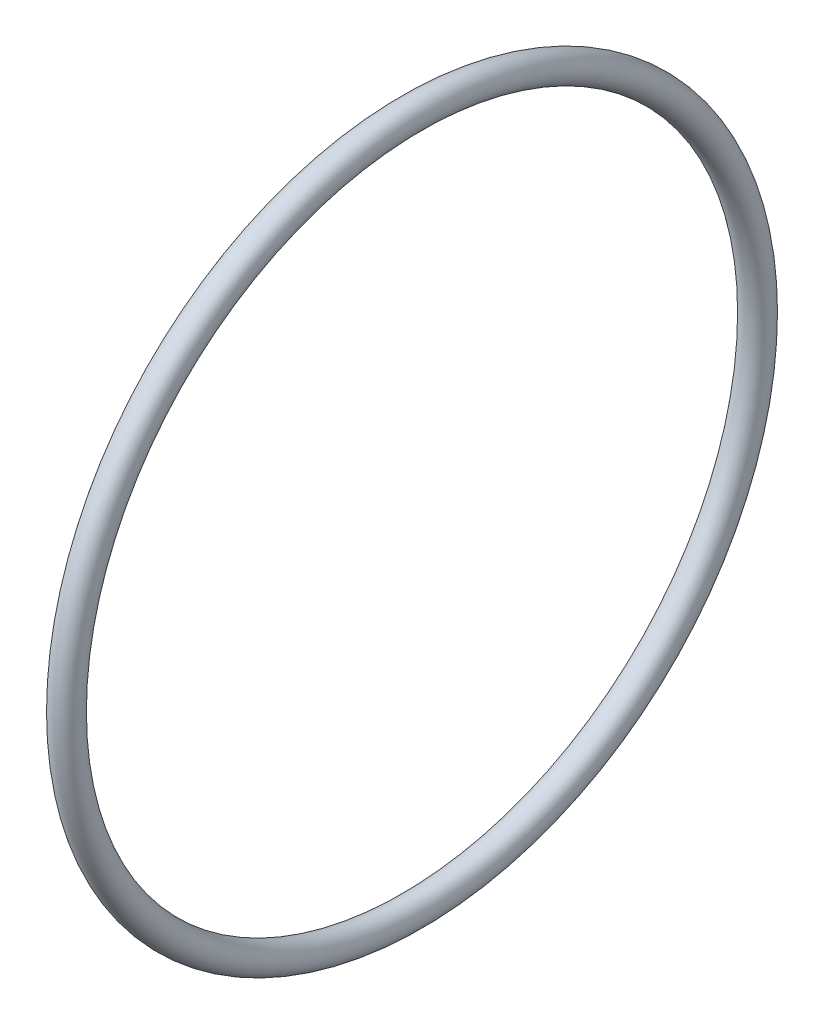
ISO-10303-21;
HEADER;
FILE_DESCRIPTION(('STEP AP214'),'2;1');
FILE_NAME('part.step','',(''),(''),'','','');
FILE_SCHEMA(('AUTOMOTIVE_DESIGN { 1 0 10303 214 1 1 1 1 }'));
ENDSEC;
DATA;
#1=APPLICATION_CONTEXT('core data for automotive mechanical design processes');
#2=APPLICATION_PROTOCOL_DEFINITION('international standard','automotive_design',2000,#1);
#3=PRODUCT_CONTEXT('',#1,'mechanical');
#4=PRODUCT('Part','Part','',(#3));
#5=PRODUCT_RELATED_PRODUCT_CATEGORY('part','',(#4));
#6=PRODUCT_DEFINITION_FORMATION('','',#4);
#7=PRODUCT_DEFINITION_CONTEXT('part definition',#1,'design');
#8=PRODUCT_DEFINITION('design','',#6,#7);
#9=PRODUCT_DEFINITION_SHAPE('','',#8);
#10=(LENGTH_UNIT() NAMED_UNIT(*) SI_UNIT(.MILLI.,.METRE.));
#11=(NAMED_UNIT(*) PLANE_ANGLE_UNIT() SI_UNIT($,.RADIAN.));
#12=(NAMED_UNIT(*) SI_UNIT($,.STERADIAN.) SOLID_ANGLE_UNIT());
#13=UNCERTAINTY_MEASURE_WITH_UNIT(LENGTH_MEASURE(1.E-05),#10,'distance_accuracy_value','');
#14=(GEOMETRIC_REPRESENTATION_CONTEXT(3) GLOBAL_UNCERTAINTY_ASSIGNED_CONTEXT((#13)) GLOBAL_UNIT_ASSIGNED_CONTEXT((#10,
#11,#12)) REPRESENTATION_CONTEXT('',''));
#15=CARTESIAN_POINT('',(0.,0.,0.));
#16=DIRECTION('',(0.,0.,1.));
#17=DIRECTION('',(1.,0.,0.));
#18=AXIS2_PLACEMENT_3D('',#15,#16,#17);
#19=CARTESIAN_POINT('',(0.,0.,0.));
#20=DIRECTION('',(-1.,0.,0.));
#21=DIRECTION('',(0.,0.,1.));
#22=AXIS2_PLACEMENT_3D('',#19,#20,#21);
#23=TOROIDAL_SURFACE('',#22,31.115,1.27);
#24=CARTESIAN_POINT('',(0.,0.,32.385));
#25=VERTEX_POINT('',#24);
#26=VERTEX_LOOP('',#25);
#27=FACE_BOUND('',#26,.T.);
#28=ADVANCED_FACE('F30',(#27),#23,.T.);
#29=CLOSED_SHELL('',(#28));
#30=MANIFOLD_SOLID_BREP('B2',#29);
#31=ADVANCED_BREP_SHAPE_REPRESENTATION('',(#18,#30),#14);
#32=SHAPE_DEFINITION_REPRESENTATION(#9,#31);
ENDSEC;
END-ISO-10303-21;
